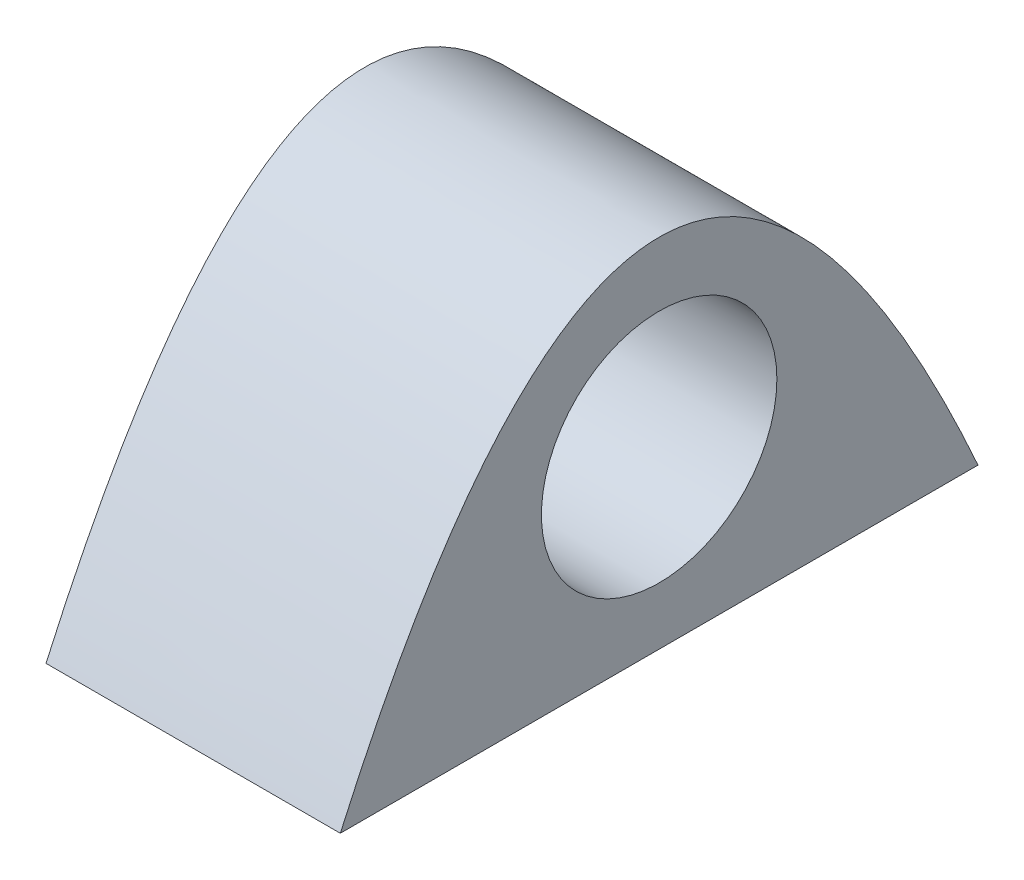
ISO-10303-21;
HEADER;
FILE_DESCRIPTION(('STEP AP214'),'2;1');
FILE_NAME('part.step','',(''),(''),'','','');
FILE_SCHEMA(('AUTOMOTIVE_DESIGN { 1 0 10303 214 1 1 1 1 }'));
ENDSEC;
DATA;
#1=APPLICATION_CONTEXT('core data for automotive mechanical design processes');
#2=APPLICATION_PROTOCOL_DEFINITION('international standard','automotive_design',2000,#1);
#3=PRODUCT_CONTEXT('',#1,'mechanical');
#4=PRODUCT('Part','Part','',(#3));
#5=PRODUCT_RELATED_PRODUCT_CATEGORY('part','',(#4));
#6=PRODUCT_DEFINITION_FORMATION('','',#4);
#7=PRODUCT_DEFINITION_CONTEXT('part definition',#1,'design');
#8=PRODUCT_DEFINITION('design','',#6,#7);
#9=PRODUCT_DEFINITION_SHAPE('','',#8);
#10=(LENGTH_UNIT() NAMED_UNIT(*) SI_UNIT(.MILLI.,.METRE.));
#11=(NAMED_UNIT(*) PLANE_ANGLE_UNIT() SI_UNIT($,.RADIAN.));
#12=(NAMED_UNIT(*) SI_UNIT($,.STERADIAN.) SOLID_ANGLE_UNIT());
#13=UNCERTAINTY_MEASURE_WITH_UNIT(LENGTH_MEASURE(1.E-05),#10,'distance_accuracy_value','');
#14=(GEOMETRIC_REPRESENTATION_CONTEXT(3) GLOBAL_UNCERTAINTY_ASSIGNED_CONTEXT((#13)) GLOBAL_UNIT_ASSIGNED_CONTEXT((#10,
#11,#12)) REPRESENTATION_CONTEXT('',''));
#15=CARTESIAN_POINT('',(0.,0.,0.));
#16=DIRECTION('',(0.,0.,1.));
#17=DIRECTION('',(1.,0.,0.));
#18=AXIS2_PLACEMENT_3D('',#15,#16,#17);
#19=CARTESIAN_POINT('',(3.,0.,3.25));
#20=CARTESIAN_POINT('',(3.,7.2754466778024,0.));
#21=CARTESIAN_POINT('',(3.,0.,-3.25));
#22=B_SPLINE_CURVE_WITH_KNOTS('',2,(#19,#20,#21),.UNSPECIFIED.,.F.,.F.,(3,3),(0.,1.),.UNSPECIFIED.);
#23=DIRECTION('',(-1.,0.,0.));
#24=VECTOR('',#23,1.);
#25=SURFACE_OF_LINEAR_EXTRUSION('',#22,#24);
#26=CARTESIAN_POINT('',(0.,0.,3.25));
#27=CARTESIAN_POINT('',(0.,7.2754466778024,0.));
#28=CARTESIAN_POINT('',(0.,0.,-3.25));
#29=B_SPLINE_CURVE_WITH_KNOTS('',2,(#26,#27,#28),.UNSPECIFIED.,.F.,.F.,(3,3),(0.,1.),.UNSPECIFIED.);
#30=CARTESIAN_POINT('',(0.,0.,3.25));
#31=VERTEX_POINT('',#30);
#32=CARTESIAN_POINT('',(0.,0.,-3.25));
#33=VERTEX_POINT('',#32);
#34=EDGE_CURVE('E73',#31,#33,#29,.T.);
#35=ORIENTED_EDGE('',*,*,#34,.F.);
#36=DIRECTION('',(-1.,0.,0.));
#37=VECTOR('',#36,1.);
#38=CARTESIAN_POINT('',(3.,0.,3.25));
#39=LINE('',#38,#37);
#40=CARTESIAN_POINT('',(3.,0.,3.25));
#41=VERTEX_POINT('',#40);
#42=EDGE_CURVE('E11',#41,#31,#39,.T.);
#43=ORIENTED_EDGE('',*,*,#42,.F.);
#44=CARTESIAN_POINT('',(3.,0.,-3.25));
#45=VERTEX_POINT('',#44);
#46=EDGE_CURVE('E74',#41,#45,#22,.T.);
#47=ORIENTED_EDGE('',*,*,#46,.T.);
#48=DIRECTION('',(-1.,0.,0.));
#49=VECTOR('',#48,1.);
#50=CARTESIAN_POINT('',(3.,0.,-3.25));
#51=LINE('',#50,#49);
#52=EDGE_CURVE('E45',#45,#33,#51,.T.);
#53=ORIENTED_EDGE('',*,*,#52,.T.);
#54=EDGE_LOOP('',(#35,#43,#47,#53));
#55=FACE_BOUND('',#54,.T.);
#56=ADVANCED_FACE('F41',(#55),#25,.T.);
#57=CARTESIAN_POINT('',(3.,0.,3.25));
#58=DIRECTION('',(0.,1.,0.));
#59=DIRECTION('',(0.,0.,1.));
#60=AXIS2_PLACEMENT_3D('',#57,#58,#59);
#61=PLANE('',#60);
#62=DIRECTION('',(0.,0.,-1.));
#63=VECTOR('',#62,1.);
#64=CARTESIAN_POINT('',(0.,0.,3.25));
#65=LINE('',#64,#63);
#66=EDGE_CURVE('E67',#31,#33,#65,.T.);
#67=ORIENTED_EDGE('',*,*,#66,.T.);
#68=ORIENTED_EDGE('',*,*,#52,.F.);
#69=DIRECTION('',(0.,0.,-1.));
#70=VECTOR('',#69,1.);
#71=CARTESIAN_POINT('',(3.,0.,3.25));
#72=LINE('',#71,#70);
#73=EDGE_CURVE('E69',#41,#45,#72,.T.);
#74=ORIENTED_EDGE('',*,*,#73,.F.);
#75=ORIENTED_EDGE('',*,*,#42,.T.);
#76=EDGE_LOOP('',(#67,#68,#74,#75));
#77=FACE_BOUND('',#76,.T.);
#78=ADVANCED_FACE('F66',(#77),#61,.F.);
#79=CARTESIAN_POINT('',(3.,3.6377233389012,0.));
#80=DIRECTION('',(1.,0.,0.));
#81=DIRECTION('',(0.,0.,-1.));
#82=AXIS2_PLACEMENT_3D('',#79,#80,#81);
#83=PLANE('',#82);
#84=CARTESIAN_POINT('',(3.,1.78493409511866,0.));
#85=DIRECTION('',(1.,0.,0.));
#86=DIRECTION('',(0.,0.,-1.));
#87=AXIS2_PLACEMENT_3D('',#84,#85,#86);
#88=CIRCLE('',#87,1.2);
#89=CARTESIAN_POINT('',(3.,1.78493409511866,-1.2));
#90=VERTEX_POINT('',#89);
#91=EDGE_CURVE('E79',#90,#90,#88,.T.);
#92=ORIENTED_EDGE('',*,*,#91,.F.);
#93=EDGE_LOOP('',(#92));
#94=FACE_BOUND('',#93,.T.);
#95=ORIENTED_EDGE('',*,*,#46,.F.);
#96=ORIENTED_EDGE('',*,*,#73,.T.);
#97=EDGE_LOOP('',(#95,#96));
#98=FACE_BOUND('',#97,.T.);
#99=ADVANCED_FACE('F99',(#94,#98),#83,.T.);
#100=CARTESIAN_POINT('',(0.,3.6377233389012,0.));
#101=DIRECTION('',(1.,0.,0.));
#102=DIRECTION('',(0.,0.,-1.));
#103=AXIS2_PLACEMENT_3D('',#100,#101,#102);
#104=PLANE('',#103);
#105=CARTESIAN_POINT('',(0.,1.78493409511866,0.));
#106=DIRECTION('',(1.,0.,0.));
#107=DIRECTION('',(0.,0.,-1.));
#108=AXIS2_PLACEMENT_3D('',#105,#106,#107);
#109=CIRCLE('',#108,1.2);
#110=CARTESIAN_POINT('',(0.,1.78493409511866,-1.2));
#111=VERTEX_POINT('',#110);
#112=EDGE_CURVE('E76',#111,#111,#109,.T.);
#113=ORIENTED_EDGE('',*,*,#112,.T.);
#114=EDGE_LOOP('',(#113));
#115=FACE_BOUND('',#114,.T.);
#116=ORIENTED_EDGE('',*,*,#34,.T.);
#117=ORIENTED_EDGE('',*,*,#66,.F.);
#118=EDGE_LOOP('',(#116,#117));
#119=FACE_BOUND('',#118,.T.);
#120=ADVANCED_FACE('F72',(#115,#119),#104,.F.);
#121=CARTESIAN_POINT('',(0.,1.78493409511866,0.));
#122=DIRECTION('',(1.,0.,0.));
#123=DIRECTION('',(0.,0.,-1.));
#124=AXIS2_PLACEMENT_3D('',#121,#122,#123);
#125=CYLINDRICAL_SURFACE('',#124,1.2);
#126=ORIENTED_EDGE('',*,*,#112,.F.);
#127=EDGE_LOOP('',(#126));
#128=FACE_BOUND('',#127,.T.);
#129=ORIENTED_EDGE('',*,*,#91,.T.);
#130=EDGE_LOOP('',(#129));
#131=FACE_BOUND('',#130,.T.);
#132=ADVANCED_FACE('F97',(#128,#131),#125,.F.);
#133=CLOSED_SHELL('',(#56,#78,#99,#120,#132));
#134=MANIFOLD_SOLID_BREP('B2',#133);
#135=ADVANCED_BREP_SHAPE_REPRESENTATION('',(#18,#134),#14);
#136=SHAPE_DEFINITION_REPRESENTATION(#9,#135);
ENDSEC;
END-ISO-10303-21;
